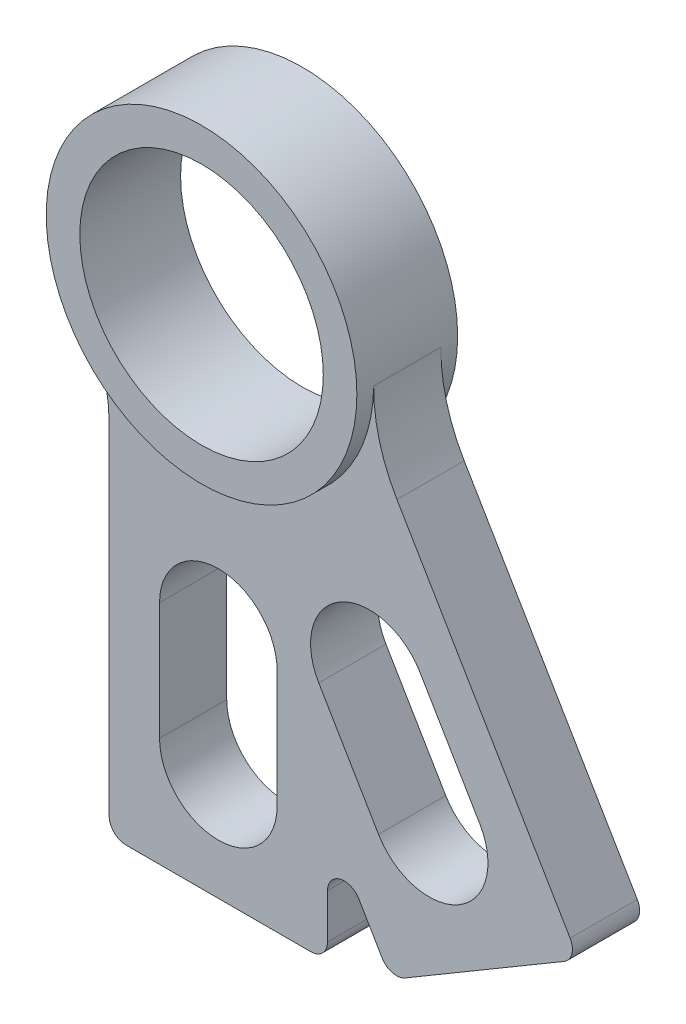
ISO-10303-21;
HEADER;
FILE_DESCRIPTION(('STEP AP214'),'2;1');
FILE_NAME('part.step','',(''),(''),'','','');
FILE_SCHEMA(('AUTOMOTIVE_DESIGN { 1 0 10303 214 1 1 1 1 }'));
ENDSEC;
DATA;
#1=APPLICATION_CONTEXT('core data for automotive mechanical design processes');
#2=APPLICATION_PROTOCOL_DEFINITION('international standard','automotive_design',2000,#1);
#3=PRODUCT_CONTEXT('',#1,'mechanical');
#4=PRODUCT('Part','Part','',(#3));
#5=PRODUCT_RELATED_PRODUCT_CATEGORY('part','',(#4));
#6=PRODUCT_DEFINITION_FORMATION('','',#4);
#7=PRODUCT_DEFINITION_CONTEXT('part definition',#1,'design');
#8=PRODUCT_DEFINITION('design','',#6,#7);
#9=PRODUCT_DEFINITION_SHAPE('','',#8);
#10=(LENGTH_UNIT() NAMED_UNIT(*) SI_UNIT(.MILLI.,.METRE.));
#11=(NAMED_UNIT(*) PLANE_ANGLE_UNIT() SI_UNIT($,.RADIAN.));
#12=(NAMED_UNIT(*) SI_UNIT($,.STERADIAN.) SOLID_ANGLE_UNIT());
#13=UNCERTAINTY_MEASURE_WITH_UNIT(LENGTH_MEASURE(1.E-05),#10,'distance_accuracy_value','');
#14=(GEOMETRIC_REPRESENTATION_CONTEXT(3) GLOBAL_UNCERTAINTY_ASSIGNED_CONTEXT((#13)) GLOBAL_UNIT_ASSIGNED_CONTEXT((#10,
#11,#12)) REPRESENTATION_CONTEXT('',''));
#15=CARTESIAN_POINT('',(0.,0.,0.));
#16=DIRECTION('',(0.,0.,1.));
#17=DIRECTION('',(1.,0.,0.));
#18=AXIS2_PLACEMENT_3D('',#15,#16,#17);
#19=CARTESIAN_POINT('',(0.,-27.9580697939255,4.7625));
#20=DIRECTION('',(0.,0.,-1.));
#21=DIRECTION('',(-1.,0.,0.));
#22=AXIS2_PLACEMENT_3D('',#19,#20,#21);
#23=CYLINDRICAL_SURFACE('',#22,5.55624999999843);
#24=CARTESIAN_POINT('',(0.,-27.9580697939255,-3.175));
#25=DIRECTION('',(0.,0.,1.));
#26=DIRECTION('',(1.,0.,0.));
#27=AXIS2_PLACEMENT_3D('',#24,#25,#26);
#28=CIRCLE('',#27,5.55624999999843);
#29=CARTESIAN_POINT('',(5.55624999999841,-27.9580697939255,-3.175));
#30=VERTEX_POINT('',#29);
#31=CARTESIAN_POINT('',(-5.55624999999843,-27.9580697939256,-3.175));
#32=VERTEX_POINT('',#31);
#33=EDGE_CURVE('E545',#30,#32,#28,.T.);
#34=ORIENTED_EDGE('',*,*,#33,.F.);
#35=DIRECTION('',(0.,0.,-1.));
#36=VECTOR('',#35,1.);
#37=CARTESIAN_POINT('',(5.55624999999843,-27.9580697939256,4.7625));
#38=LINE('',#37,#36);
#39=CARTESIAN_POINT('',(5.55624999999843,-27.9580697939256,3.175));
#40=VERTEX_POINT('',#39);
#41=EDGE_CURVE('E395',#40,#30,#38,.T.);
#42=ORIENTED_EDGE('',*,*,#41,.F.);
#43=CARTESIAN_POINT('',(0.,-27.9580697939255,3.175));
#44=DIRECTION('',(0.,0.,1.));
#45=DIRECTION('',(1.,0.,0.));
#46=AXIS2_PLACEMENT_3D('',#43,#44,#45);
#47=CIRCLE('',#46,5.55624999999843);
#48=CARTESIAN_POINT('',(-5.55624999999843,-27.9580697939256,3.175));
#49=VERTEX_POINT('',#48);
#50=EDGE_CURVE('E503',#40,#49,#47,.T.);
#51=ORIENTED_EDGE('',*,*,#50,.T.);
#52=DIRECTION('',(0.,0.,-1.));
#53=VECTOR('',#52,1.);
#54=CARTESIAN_POINT('',(-5.55624999999843,-27.9580697939256,4.7625));
#55=LINE('',#54,#53);
#56=EDGE_CURVE('E372',#49,#32,#55,.T.);
#57=ORIENTED_EDGE('',*,*,#56,.T.);
#58=EDGE_LOOP('',(#34,#42,#51,#57));
#59=FACE_BOUND('',#58,.T.);
#60=ADVANCED_FACE('F195',(#59),#23,.F.);
#61=CARTESIAN_POINT('',(5.55624999999831,0.,4.7625));
#62=DIRECTION('',(-1.,0.,0.));
#63=DIRECTION('',(0.,-1.,0.));
#64=AXIS2_PLACEMENT_3D('',#61,#62,#63);
#65=PLANE('',#64);
#66=DIRECTION('',(0.,1.,0.));
#67=VECTOR('',#66,1.);
#68=CARTESIAN_POINT('',(5.55624999999831,0.,-3.175));
#69=LINE('',#68,#67);
#70=CARTESIAN_POINT('',(5.55624999999842,-39.0705697939288,-3.175));
#71=VERTEX_POINT('',#70);
#72=EDGE_CURVE('E562',#71,#30,#69,.T.);
#73=ORIENTED_EDGE('',*,*,#72,.F.);
#74=DIRECTION('',(0.,0.,-1.));
#75=VECTOR('',#74,1.);
#76=CARTESIAN_POINT('',(5.55624999999848,-39.0705697939288,4.7625));
#77=LINE('',#76,#75);
#78=CARTESIAN_POINT('',(5.55624999999848,-39.0705697939288,3.175));
#79=VERTEX_POINT('',#78);
#80=EDGE_CURVE('E540',#79,#71,#77,.T.);
#81=ORIENTED_EDGE('',*,*,#80,.F.);
#82=DIRECTION('',(0.,-1.,0.));
#83=VECTOR('',#82,1.);
#84=CARTESIAN_POINT('',(5.55624999999831,0.,3.175));
#85=LINE('',#84,#83);
#86=EDGE_CURVE('E509',#40,#79,#85,.T.);
#87=ORIENTED_EDGE('',*,*,#86,.F.);
#88=ORIENTED_EDGE('',*,*,#41,.T.);
#89=EDGE_LOOP('',(#73,#81,#87,#88));
#90=FACE_BOUND('',#89,.T.);
#91=ADVANCED_FACE('F539',(#90),#65,.T.);
#92=CARTESIAN_POINT('',(0.,-39.0705697939288,4.7625));
#93=DIRECTION('',(0.,0.,-1.));
#94=DIRECTION('',(-1.,0.,0.));
#95=AXIS2_PLACEMENT_3D('',#92,#93,#94);
#96=CYLINDRICAL_SURFACE('',#95,5.55624999999845);
#97=CARTESIAN_POINT('',(0.,-39.0705697939288,-3.175));
#98=DIRECTION('',(0.,0.,1.));
#99=DIRECTION('',(1.,0.,0.));
#100=AXIS2_PLACEMENT_3D('',#97,#98,#99);
#101=CIRCLE('',#100,5.55624999999845);
#102=CARTESIAN_POINT('',(-5.55624999999848,-39.0705697939288,-3.175));
#103=VERTEX_POINT('',#102);
#104=EDGE_CURVE('E564',#103,#71,#101,.T.);
#105=ORIENTED_EDGE('',*,*,#104,.F.);
#106=DIRECTION('',(0.,0.,-1.));
#107=VECTOR('',#106,1.);
#108=CARTESIAN_POINT('',(-5.55624999999842,-39.0705697939288,4.7625));
#109=LINE('',#108,#107);
#110=CARTESIAN_POINT('',(-5.55624999999842,-39.0705697939288,3.175));
#111=VERTEX_POINT('',#110);
#112=EDGE_CURVE('E547',#111,#103,#109,.T.);
#113=ORIENTED_EDGE('',*,*,#112,.F.);
#114=CARTESIAN_POINT('',(0.,-39.0705697939288,3.175));
#115=DIRECTION('',(0.,0.,1.));
#116=DIRECTION('',(1.,0.,0.));
#117=AXIS2_PLACEMENT_3D('',#114,#115,#116);
#118=CIRCLE('',#117,5.55624999999845);
#119=EDGE_CURVE('E525',#111,#79,#118,.T.);
#120=ORIENTED_EDGE('',*,*,#119,.T.);
#121=ORIENTED_EDGE('',*,*,#80,.T.);
#122=EDGE_LOOP('',(#105,#113,#120,#121));
#123=FACE_BOUND('',#122,.T.);
#124=ADVANCED_FACE('F603',(#123),#96,.F.);
#125=CARTESIAN_POINT('',(14.2753624537517,-24.1864667147498,4.7625));
#126=DIRECTION('',(0.,0.,-1.));
#127=DIRECTION('',(-1.,0.,0.));
#128=AXIS2_PLACEMENT_3D('',#125,#126,#127);
#129=CYLINDRICAL_SURFACE('',#128,5.55624999999839);
#130=CARTESIAN_POINT('',(14.2753624537518,-24.1864667147499,-3.175));
#131=DIRECTION('',(0.,0.,1.));
#132=DIRECTION('',(1.,0.,0.));
#133=AXIS2_PLACEMENT_3D('',#130,#131,#132);
#134=CIRCLE('',#133,5.55624999999841);
#135=CARTESIAN_POINT('',(19.0603267308516,-21.3622799416485,-3.175));
#136=VERTEX_POINT('',#135);
#137=CARTESIAN_POINT('',(9.49039817665191,-27.0106534878512,-3.175));
#138=VERTEX_POINT('',#137);
#139=EDGE_CURVE('E365',#136,#138,#134,.T.);
#140=ORIENTED_EDGE('',*,*,#139,.F.);
#141=DIRECTION('',(0.,0.,-1.));
#142=VECTOR('',#141,1.);
#143=CARTESIAN_POINT('',(19.0603267308515,-21.3622799416484,4.7625));
#144=LINE('',#143,#142);
#145=CARTESIAN_POINT('',(19.0603267308516,-21.3622799416485,3.175));
#146=VERTEX_POINT('',#145);
#147=EDGE_CURVE('E364',#146,#136,#144,.T.);
#148=ORIENTED_EDGE('',*,*,#147,.F.);
#149=CARTESIAN_POINT('',(14.2753624537518,-24.1864667147499,3.175));
#150=DIRECTION('',(0.,0.,1.));
#151=DIRECTION('',(1.,0.,0.));
#152=AXIS2_PLACEMENT_3D('',#149,#150,#151);
#153=CIRCLE('',#152,5.55624999999841);
#154=CARTESIAN_POINT('',(9.49039817665196,-27.0106534878513,3.175));
#155=VERTEX_POINT('',#154);
#156=EDGE_CURVE('E514',#146,#155,#153,.T.);
#157=ORIENTED_EDGE('',*,*,#156,.T.);
#158=DIRECTION('',(0.,0.,-1.));
#159=VECTOR('',#158,1.);
#160=CARTESIAN_POINT('',(9.49039817665191,-27.0106534878512,4.7625));
#161=LINE('',#160,#159);
#162=EDGE_CURVE('E374',#155,#138,#161,.T.);
#163=ORIENTED_EDGE('',*,*,#162,.T.);
#164=EDGE_LOOP('',(#140,#148,#157,#163));
#165=FACE_BOUND('',#164,.T.);
#166=ADVANCED_FACE('F552',(#165),#129,.F.);
#167=CARTESIAN_POINT('',(4.78496427709968,2.82418677310135,4.7625));
#168=DIRECTION('',(-0.861185921638007,-0.508290082898041,0.));
#169=DIRECTION('',(0.508290082898041,-0.861185921638007,0.));
#170=AXIS2_PLACEMENT_3D('',#167,#168,#169);
#171=PLANE('',#170);
#172=DIRECTION('',(-0.508290082898038,0.861185921638008,0.));
#173=VECTOR('',#172,1.);
#174=CARTESIAN_POINT('',(4.78496427709981,2.82418677310141,-3.175));
#175=LINE('',#174,#173);
#176=CARTESIAN_POINT('',(24.7087002770577,-30.9322084958536,-3.175));
#177=VERTEX_POINT('',#176);
#178=EDGE_CURVE('E347',#177,#136,#175,.T.);
#179=ORIENTED_EDGE('',*,*,#178,.F.);
#180=DIRECTION('',(0.,0.,-1.));
#181=VECTOR('',#180,1.);
#182=CARTESIAN_POINT('',(24.7087002770581,-30.9322084958544,4.7625));
#183=LINE('',#182,#181);
#184=CARTESIAN_POINT('',(24.7087002770577,-30.9322084958536,3.175));
#185=VERTEX_POINT('',#184);
#186=EDGE_CURVE('E362',#185,#177,#183,.T.);
#187=ORIENTED_EDGE('',*,*,#186,.F.);
#188=DIRECTION('',(0.508290082898038,-0.861185921638008,0.));
#189=VECTOR('',#188,1.);
#190=CARTESIAN_POINT('',(4.78496427709981,2.82418677310141,3.175));
#191=LINE('',#190,#189);
#192=EDGE_CURVE('E520',#146,#185,#191,.T.);
#193=ORIENTED_EDGE('',*,*,#192,.F.);
#194=ORIENTED_EDGE('',*,*,#147,.T.);
#195=EDGE_LOOP('',(#179,#187,#193,#194));
#196=FACE_BOUND('',#195,.T.);
#197=ADVANCED_FACE('F360',(#196),#171,.T.);
#198=CARTESIAN_POINT('',(19.9237359999578,-33.7563952689549,4.7625));
#199=DIRECTION('',(0.,0.,-1.));
#200=DIRECTION('',(-1.,0.,0.));
#201=AXIS2_PLACEMENT_3D('',#198,#199,#200);
#202=CYLINDRICAL_SURFACE('',#201,5.55624999999839);
#203=CARTESIAN_POINT('',(19.9237359999578,-33.756395268955,-3.175));
#204=DIRECTION('',(0.,0.,1.));
#205=DIRECTION('',(1.,0.,0.));
#206=AXIS2_PLACEMENT_3D('',#203,#204,#205);
#207=CIRCLE('',#206,5.55624999999841);
#208=CARTESIAN_POINT('',(15.138771722858,-36.5805820420564,-3.175));
#209=VERTEX_POINT('',#208);
#210=EDGE_CURVE('E343',#209,#177,#207,.T.);
#211=ORIENTED_EDGE('',*,*,#210,.F.);
#212=DIRECTION('',(0.,0.,-1.));
#213=VECTOR('',#212,1.);
#214=CARTESIAN_POINT('',(15.1387717228585,-36.5805820420572,4.7625));
#215=LINE('',#214,#213);
#216=CARTESIAN_POINT('',(15.1387717228585,-36.5805820420572,3.175));
#217=VERTEX_POINT('',#216);
#218=EDGE_CURVE('E370',#217,#209,#215,.T.);
#219=ORIENTED_EDGE('',*,*,#218,.F.);
#220=CARTESIAN_POINT('',(19.9237359999578,-33.756395268955,3.175));
#221=DIRECTION('',(0.,0.,1.));
#222=DIRECTION('',(1.,0.,0.));
#223=AXIS2_PLACEMENT_3D('',#220,#221,#222);
#224=CIRCLE('',#223,5.55624999999841);
#225=EDGE_CURVE('E369',#217,#185,#224,.T.);
#226=ORIENTED_EDGE('',*,*,#225,.T.);
#227=ORIENTED_EDGE('',*,*,#186,.T.);
#228=EDGE_LOOP('',(#211,#219,#226,#227));
#229=FACE_BOUND('',#228,.T.);
#230=ADVANCED_FACE('F368',(#229),#202,.F.);
#231=CARTESIAN_POINT('',(30.5552874473023,-0.236151334171532,4.7625));
#232=DIRECTION('',(0.,0.,-1.));
#233=DIRECTION('',(-1.,0.,0.));
#234=AXIS2_PLACEMENT_3D('',#231,#232,#233);
#235=CYLINDRICAL_SURFACE('',#234,15.8749999999985);
#236=DIRECTION('',(0.,0.,-1.));
#237=VECTOR('',#236,1.);
#238=CARTESIAN_POINT('',(16.8839609413002,-8.30525640017702,4.7625));
#239=LINE('',#238,#237);
#240=CARTESIAN_POINT('',(16.8839609413003,-8.30525640017706,3.175));
#241=VERTEX_POINT('',#240);
#242=CARTESIAN_POINT('',(16.8839609413003,-8.30525640017706,-3.175));
#243=VERTEX_POINT('',#242);
#244=EDGE_CURVE('E378',#241,#243,#239,.T.);
#245=ORIENTED_EDGE('',*,*,#244,.T.);
#246=CARTESIAN_POINT('',(30.5552874473023,-0.236151334171521,-3.175));
#247=DIRECTION('',(0.,0.,1.));
#248=DIRECTION('',(1.,0.,0.));
#249=AXIS2_PLACEMENT_3D('',#246,#247,#248);
#250=CIRCLE('',#249,15.8749999999984);
#251=CARTESIAN_POINT('',(14.68076154991,-0.113462569535451,-3.175));
#252=VERTEX_POINT('',#251);
#253=EDGE_CURVE('E568',#252,#243,#250,.T.);
#254=ORIENTED_EDGE('',*,*,#253,.F.);
#255=DIRECTION('',(0.,0.,-1.));
#256=VECTOR('',#255,1.);
#257=CARTESIAN_POINT('',(14.68076154991,-0.113462569535464,4.7625));
#258=LINE('',#257,#256);
#259=CARTESIAN_POINT('',(14.68076154991,-0.113462569535451,3.175));
#260=VERTEX_POINT('',#259);
#261=EDGE_CURVE('E388',#260,#252,#258,.T.);
#262=ORIENTED_EDGE('',*,*,#261,.F.);
#263=CARTESIAN_POINT('',(30.5552874473023,-0.236151334171521,3.175));
#264=DIRECTION('',(0.,0.,1.));
#265=DIRECTION('',(1.,0.,0.));
#266=AXIS2_PLACEMENT_3D('',#263,#264,#265);
#267=CIRCLE('',#266,15.8749999999984);
#268=EDGE_CURVE('E471',#260,#241,#267,.T.);
#269=ORIENTED_EDGE('',*,*,#268,.T.);
#270=EDGE_LOOP('',(#245,#254,#262,#269));
#271=FACE_BOUND('',#270,.T.);
#272=ADVANCED_FACE('F613',(#271),#235,.F.);
#273=CARTESIAN_POINT('',(-26.1937499999968,-15.7343197939272,4.7625));
#274=DIRECTION('',(0.,0.,-1.));
#275=DIRECTION('',(-1.,0.,0.));
#276=AXIS2_PLACEMENT_3D('',#273,#274,#275);
#277=CYLINDRICAL_SURFACE('',#276,15.8749999999984);
#278=CARTESIAN_POINT('',(-26.1937499999968,-15.7343197939272,-3.175));
#279=DIRECTION('',(0.,0.,1.));
#280=DIRECTION('',(1.,0.,0.));
#281=AXIS2_PLACEMENT_3D('',#278,#279,#280);
#282=CIRCLE('',#281,15.8749999999984);
#283=CARTESIAN_POINT('',(-10.3187499999984,-15.7343197939272,-3.175));
#284=VERTEX_POINT('',#283);
#285=CARTESIAN_POINT('',(-12.5851932668321,-7.55979787272683,-3.175));
#286=VERTEX_POINT('',#285);
#287=EDGE_CURVE('E573',#284,#286,#282,.T.);
#288=ORIENTED_EDGE('',*,*,#287,.F.);
#289=DIRECTION('',(0.,0.,-1.));
#290=VECTOR('',#289,1.);
#291=CARTESIAN_POINT('',(-10.3187499999984,-15.7343197939272,4.7625));
#292=LINE('',#291,#290);
#293=CARTESIAN_POINT('',(-10.3187499999984,-15.7343197939272,3.175));
#294=VERTEX_POINT('',#293);
#295=EDGE_CURVE('E381',#294,#284,#292,.T.);
#296=ORIENTED_EDGE('',*,*,#295,.F.);
#297=CARTESIAN_POINT('',(-26.1937499999968,-15.7343197939272,3.175));
#298=DIRECTION('',(0.,0.,1.));
#299=DIRECTION('',(1.,0.,0.));
#300=AXIS2_PLACEMENT_3D('',#297,#298,#299);
#301=CIRCLE('',#300,15.8749999999984);
#302=CARTESIAN_POINT('',(-12.5851932668321,-7.55979787272683,3.175));
#303=VERTEX_POINT('',#302);
#304=EDGE_CURVE('E465',#294,#303,#301,.T.);
#305=ORIENTED_EDGE('',*,*,#304,.T.);
#306=DIRECTION('',(0.,0.,-1.));
#307=VECTOR('',#306,1.);
#308=CARTESIAN_POINT('',(-12.5851932668321,-7.55979787272684,4.7625));
#309=LINE('',#308,#307);
#310=EDGE_CURVE('E385',#303,#286,#309,.T.);
#311=ORIENTED_EDGE('',*,*,#310,.T.);
#312=EDGE_LOOP('',(#288,#296,#305,#311));
#313=FACE_BOUND('',#312,.T.);
#314=ADVANCED_FACE('F637',(#313),#277,.F.);
#315=CARTESIAN_POINT('',(-10.3187499999984,0.,4.7625));
#316=DIRECTION('',(1.,0.,0.));
#317=DIRECTION('',(0.,1.,0.));
#318=AXIS2_PLACEMENT_3D('',#315,#316,#317);
#319=PLANE('',#318);
#320=DIRECTION('',(0.,-1.,0.));
#321=VECTOR('',#320,1.);
#322=CARTESIAN_POINT('',(-10.3187499999984,0.,-3.175));
#323=LINE('',#322,#321);
#324=CARTESIAN_POINT('',(-10.3187499999984,-47.8018197939272,-3.175));
#325=VERTEX_POINT('',#324);
#326=EDGE_CURVE('E576',#284,#325,#323,.T.);
#327=ORIENTED_EDGE('',*,*,#326,.T.);
#328=DIRECTION('',(0.,0.,-1.));
#329=VECTOR('',#328,1.);
#330=CARTESIAN_POINT('',(-10.3187499999984,-47.8018197939272,4.7625));
#331=LINE('',#330,#329);
#332=CARTESIAN_POINT('',(-10.3187499999984,-47.8018197939272,3.175));
#333=VERTEX_POINT('',#332);
#334=EDGE_CURVE('E430',#325,#333,#331,.F.);
#335=ORIENTED_EDGE('',*,*,#334,.T.);
#336=DIRECTION('',(0.,1.,0.));
#337=VECTOR('',#336,1.);
#338=CARTESIAN_POINT('',(-10.3187499999984,0.,3.175));
#339=LINE('',#338,#337);
#340=EDGE_CURVE('E463',#333,#294,#339,.T.);
#341=ORIENTED_EDGE('',*,*,#340,.T.);
#342=ORIENTED_EDGE('',*,*,#295,.T.);
#343=EDGE_LOOP('',(#327,#335,#341,#342));
#344=FACE_BOUND('',#343,.T.);
#345=ADVANCED_FACE('F633',(#344),#319,.F.);
#346=CARTESIAN_POINT('',(0.,-49.3893197939272,4.7625));
#347=DIRECTION('',(0.,1.,0.));
#348=DIRECTION('',(-1.,0.,0.));
#349=AXIS2_PLACEMENT_3D('',#346,#347,#348);
#350=PLANE('',#349);
#351=DIRECTION('',(1.,0.,0.));
#352=VECTOR('',#351,1.);
#353=CARTESIAN_POINT('',(0.,-49.3893197939272,-3.175));
#354=LINE('',#353,#352);
#355=CARTESIAN_POINT('',(-8.73124999999842,-49.3893197939272,-3.175));
#356=VERTEX_POINT('',#355);
#357=CARTESIAN_POINT('',(8.73124999999837,-49.3893197939272,-3.175));
#358=VERTEX_POINT('',#357);
#359=EDGE_CURVE('E445',#356,#358,#354,.T.);
#360=ORIENTED_EDGE('',*,*,#359,.T.);
#361=DIRECTION('',(0.,0.,-1.));
#362=VECTOR('',#361,1.);
#363=CARTESIAN_POINT('',(8.73124999999837,-49.3893197939272,3.175));
#364=LINE('',#363,#362);
#365=CARTESIAN_POINT('',(8.73124999999837,-49.3893197939272,3.175));
#366=VERTEX_POINT('',#365);
#367=EDGE_CURVE('E428',#358,#366,#364,.F.);
#368=ORIENTED_EDGE('',*,*,#367,.T.);
#369=DIRECTION('',(-1.,0.,0.));
#370=VECTOR('',#369,1.);
#371=CARTESIAN_POINT('',(0.,-49.3893197939272,3.175));
#372=LINE('',#371,#370);
#373=CARTESIAN_POINT('',(-8.73124999999842,-49.3893197939272,3.175));
#374=VERTEX_POINT('',#373);
#375=EDGE_CURVE('E454',#366,#374,#372,.T.);
#376=ORIENTED_EDGE('',*,*,#375,.T.);
#377=DIRECTION('',(0.,0.,-1.));
#378=VECTOR('',#377,1.);
#379=CARTESIAN_POINT('',(-8.73124999999842,-49.3893197939272,4.7625));
#380=LINE('',#379,#378);
#381=EDGE_CURVE('E425',#374,#356,#380,.T.);
#382=ORIENTED_EDGE('',*,*,#381,.T.);
#383=EDGE_LOOP('',(#360,#368,#376,#382));
#384=FACE_BOUND('',#383,.T.);
#385=ADVANCED_FACE('F630',(#384),#350,.F.);
#386=CARTESIAN_POINT('',(10.3187499999986,0.,4.7625));
#387=DIRECTION('',(1.,0.,0.));
#388=DIRECTION('',(0.,1.,0.));
#389=AXIS2_PLACEMENT_3D('',#386,#387,#388);
#390=PLANE('',#389);
#391=DIRECTION('',(0.,-1.,0.));
#392=VECTOR('',#391,1.);
#393=CARTESIAN_POINT('',(10.3187499999986,0.,-3.175));
#394=LINE('',#393,#392);
#395=CARTESIAN_POINT('',(10.3187499999984,-43.5966500726412,-3.175));
#396=VERTEX_POINT('',#395);
#397=CARTESIAN_POINT('',(10.3187499999984,-47.8018197939272,-3.175));
#398=VERTEX_POINT('',#397);
#399=EDGE_CURVE('E436',#396,#398,#394,.T.);
#400=ORIENTED_EDGE('',*,*,#399,.F.);
#401=DIRECTION('',(0.,0.,-1.));
#402=VECTOR('',#401,1.);
#403=CARTESIAN_POINT('',(10.3187499999984,-43.5966500726412,3.175));
#404=LINE('',#403,#402);
#405=CARTESIAN_POINT('',(10.3187499999984,-43.5966500726412,3.175));
#406=VERTEX_POINT('',#405);
#407=EDGE_CURVE('E423',#396,#406,#404,.F.);
#408=ORIENTED_EDGE('',*,*,#407,.T.);
#409=DIRECTION('',(0.,1.,0.));
#410=VECTOR('',#409,1.);
#411=CARTESIAN_POINT('',(10.3187499999986,0.,3.175));
#412=LINE('',#411,#410);
#413=CARTESIAN_POINT('',(10.3187499999984,-47.8018197939272,3.175));
#414=VERTEX_POINT('',#413);
#415=EDGE_CURVE('E451',#414,#406,#412,.T.);
#416=ORIENTED_EDGE('',*,*,#415,.F.);
#417=DIRECTION('',(0.,0.,-1.));
#418=VECTOR('',#417,1.);
#419=CARTESIAN_POINT('',(10.3187499999984,-47.8018197939272,-3.175));
#420=LINE('',#419,#418);
#421=EDGE_CURVE('E420',#414,#398,#420,.T.);
#422=ORIENTED_EDGE('',*,*,#421,.T.);
#423=EDGE_LOOP('',(#400,#408,#416,#422));
#424=FACE_BOUND('',#423,.T.);
#425=ADVANCED_FACE('F442',(#424),#390,.T.);
#426=CARTESIAN_POINT('',(-8.88636222890087,-5.24491829290337,4.7625));
#427=DIRECTION('',(-0.861185921638007,-0.508290082898039,0.));
#428=DIRECTION('',(0.508290082898039,-0.861185921638007,0.));
#429=AXIS2_PLACEMENT_3D('',#426,#427,#428);
#430=PLANE('',#429);
#431=DIRECTION('',(-0.508290082898037,0.861185921638009,0.));
#432=VECTOR('',#431,1.);
#433=CARTESIAN_POINT('',(-8.88636222890078,-5.24491829290328,-3.175));
#434=LINE('',#433,#432);
#435=CARTESIAN_POINT('',(15.4753815573597,-46.5205431401588,-3.175));
#436=VERTEX_POINT('',#435);
#437=CARTESIAN_POINT('',(13.2733826505987,-42.7897395660406,-3.175));
#438=VERTEX_POINT('',#437);
#439=EDGE_CURVE('E437',#436,#438,#434,.T.);
#440=ORIENTED_EDGE('',*,*,#439,.F.);
#441=DIRECTION('',(0.,0.,-1.));
#442=VECTOR('',#441,1.);
#443=CARTESIAN_POINT('',(15.4753815573597,-46.5205431401588,3.175));
#444=LINE('',#443,#442);
#445=CARTESIAN_POINT('',(15.4753815573597,-46.5205431401588,3.175));
#446=VERTEX_POINT('',#445);
#447=EDGE_CURVE('E210',#436,#446,#444,.F.);
#448=ORIENTED_EDGE('',*,*,#447,.T.);
#449=DIRECTION('',(0.508290082898037,-0.861185921638009,0.));
#450=VECTOR('',#449,1.);
#451=CARTESIAN_POINT('',(-8.88636222890078,-5.24491829290328,3.175));
#452=LINE('',#451,#450);
#453=CARTESIAN_POINT('',(13.2733826505987,-42.7897395660406,3.175));
#454=VERTEX_POINT('',#453);
#455=EDGE_CURVE('E449',#454,#446,#452,.T.);
#456=ORIENTED_EDGE('',*,*,#455,.F.);
#457=DIRECTION('',(0.,0.,-1.));
#458=VECTOR('',#457,1.);
#459=CARTESIAN_POINT('',(13.2733826505987,-42.7897395660406,-3.175));
#460=LINE('',#459,#458);
#461=EDGE_CURVE('E416',#454,#438,#460,.T.);
#462=ORIENTED_EDGE('',*,*,#461,.T.);
#463=EDGE_LOOP('',(#440,#448,#456,#462));
#464=FACE_BOUND('',#463,.T.);
#465=ADVANCED_FACE('F448',(#464),#430,.T.);
#466=CARTESIAN_POINT('',(25.1686542928595,-42.6427574978573,4.7625));
#467=DIRECTION('',(-0.508290082898,0.861185921638031,0.));
#468=DIRECTION('',(-0.861185921638031,-0.508290082898,0.));
#469=AXIS2_PLACEMENT_3D('',#466,#467,#468);
#470=PLANE('',#469);
#471=DIRECTION('',(0.861185921638008,0.508290082898038,0.));
#472=VECTOR('',#471,1.);
#473=CARTESIAN_POINT('',(25.1686542928612,-42.6427574978558,-3.175));
#474=LINE('',#473,#472);
#475=CARTESIAN_POINT('',(17.6494247145606,-47.0807652841585,-3.175));
#476=VERTEX_POINT('',#475);
#477=CARTESIAN_POINT('',(32.6878838711616,-38.2047497115532,-3.175));
#478=VERTEX_POINT('',#477);
#479=EDGE_CURVE('E582',#476,#478,#474,.T.);
#480=ORIENTED_EDGE('',*,*,#479,.T.);
#481=DIRECTION('',(0.,0.,-1.));
#482=VECTOR('',#481,1.);
#483=CARTESIAN_POINT('',(32.687883871162,-38.2047497115539,4.7625));
#484=LINE('',#483,#482);
#485=CARTESIAN_POINT('',(32.6878838711616,-38.2047497115532,3.175));
#486=VERTEX_POINT('',#485);
#487=EDGE_CURVE('E406',#478,#486,#484,.F.);
#488=ORIENTED_EDGE('',*,*,#487,.T.);
#489=DIRECTION('',(-0.861185921638008,-0.508290082898038,0.));
#490=VECTOR('',#489,1.);
#491=CARTESIAN_POINT('',(25.1686542928612,-42.6427574978558,3.175));
#492=LINE('',#491,#490);
#493=CARTESIAN_POINT('',(17.6494247145606,-47.0807652841585,3.175));
#494=VERTEX_POINT('',#493);
#495=EDGE_CURVE('E452',#486,#494,#492,.T.);
#496=ORIENTED_EDGE('',*,*,#495,.T.);
#497=DIRECTION('',(0.,0.,-1.));
#498=VECTOR('',#497,1.);
#499=CARTESIAN_POINT('',(17.6494247145607,-47.0807652841585,-3.175));
#500=LINE('',#499,#498);
#501=EDGE_CURVE('E403',#494,#476,#500,.T.);
#502=ORIENTED_EDGE('',*,*,#501,.T.);
#503=EDGE_LOOP('',(#480,#488,#496,#502));
#504=FACE_BOUND('',#503,.T.);
#505=ADVANCED_FACE('F622',(#504),#470,.F.);
#506=CARTESIAN_POINT('',(-5.55624999999844,0.,4.7625));
#507=DIRECTION('',(-1.,0.,0.));
#508=DIRECTION('',(0.,-1.,0.));
#509=AXIS2_PLACEMENT_3D('',#506,#507,#508);
#510=PLANE('',#509);
#511=ORIENTED_EDGE('',*,*,#112,.T.);
#512=DIRECTION('',(0.,1.,0.));
#513=VECTOR('',#512,1.);
#514=CARTESIAN_POINT('',(-5.55624999999844,0.,-3.175));
#515=LINE('',#514,#513);
#516=EDGE_CURVE('E355',#103,#32,#515,.T.);
#517=ORIENTED_EDGE('',*,*,#516,.T.);
#518=ORIENTED_EDGE('',*,*,#56,.F.);
#519=DIRECTION('',(0.,-1.,0.));
#520=VECTOR('',#519,1.);
#521=CARTESIAN_POINT('',(-5.55624999999844,0.,3.175));
#522=LINE('',#521,#520);
#523=EDGE_CURVE('E508',#49,#111,#522,.T.);
#524=ORIENTED_EDGE('',*,*,#523,.T.);
#525=EDGE_LOOP('',(#511,#517,#518,#524));
#526=FACE_BOUND('',#525,.T.);
#527=ADVANCED_FACE('F610',(#526),#510,.F.);
#528=CARTESIAN_POINT('',(-4.78496427709989,-2.82418677310147,4.7625));
#529=DIRECTION('',(-0.861185921638007,-0.50829008289804,0.));
#530=DIRECTION('',(0.50829008289804,-0.861185921638007,0.));
#531=AXIS2_PLACEMENT_3D('',#528,#529,#530);
#532=PLANE('',#531);
#533=ORIENTED_EDGE('',*,*,#218,.T.);
#534=DIRECTION('',(-0.508290082898038,0.861185921638008,0.));
#535=VECTOR('',#534,1.);
#536=CARTESIAN_POINT('',(-4.78496427709981,-2.82418677310141,-3.175));
#537=LINE('',#536,#535);
#538=EDGE_CURVE('E350',#209,#138,#537,.T.);
#539=ORIENTED_EDGE('',*,*,#538,.T.);
#540=ORIENTED_EDGE('',*,*,#162,.F.);
#541=DIRECTION('',(0.508290082898038,-0.861185921638008,0.));
#542=VECTOR('',#541,1.);
#543=CARTESIAN_POINT('',(-4.78496427709981,-2.82418677310141,3.175));
#544=LINE('',#543,#542);
#545=EDGE_CURVE('E519',#155,#217,#544,.T.);
#546=ORIENTED_EDGE('',*,*,#545,.T.);
#547=EDGE_LOOP('',(#533,#539,#540,#546));
#548=FACE_BOUND('',#547,.T.);
#549=ADVANCED_FACE('F554',(#548),#532,.F.);
#550=CARTESIAN_POINT('',(8.88636222890067,5.24491829290326,4.7625));
#551=DIRECTION('',(-0.861185921638007,-0.50829008289804,0.));
#552=DIRECTION('',(0.50829008289804,-0.861185921638007,0.));
#553=AXIS2_PLACEMENT_3D('',#550,#551,#552);
#554=PLANE('',#553);
#555=DIRECTION('',(0.508290082898037,-0.861185921638009,0.));
#556=VECTOR('',#555,1.);
#557=CARTESIAN_POINT('',(8.88636222890083,5.24491829290331,3.175));
#558=LINE('',#557,#556);
#559=CARTESIAN_POINT('',(33.2481060151617,-36.0307065543529,3.175));
#560=VERTEX_POINT('',#559);
#561=EDGE_CURVE('E457',#241,#560,#558,.T.);
#562=ORIENTED_EDGE('',*,*,#561,.T.);
#563=DIRECTION('',(0.,0.,-1.));
#564=VECTOR('',#563,1.);
#565=CARTESIAN_POINT('',(33.2481060151617,-36.0307065543528,4.7625));
#566=LINE('',#565,#564);
#567=CARTESIAN_POINT('',(33.2481060151617,-36.0307065543529,-3.175));
#568=VERTEX_POINT('',#567);
#569=EDGE_CURVE('E391',#560,#568,#566,.T.);
#570=ORIENTED_EDGE('',*,*,#569,.T.);
#571=DIRECTION('',(-0.508290082898037,0.861185921638009,0.));
#572=VECTOR('',#571,1.);
#573=CARTESIAN_POINT('',(8.88636222890083,5.24491829290331,-3.175));
#574=LINE('',#573,#572);
#575=EDGE_CURVE('E566',#568,#243,#574,.T.);
#576=ORIENTED_EDGE('',*,*,#575,.T.);
#577=ORIENTED_EDGE('',*,*,#244,.F.);
#578=EDGE_LOOP('',(#562,#570,#576,#577));
#579=FACE_BOUND('',#578,.T.);
#580=ADVANCED_FACE('F609',(#579),#554,.F.);
#581=CARTESIAN_POINT('',(0.,0.,4.7625));
#582=DIRECTION('',(0.,0.,1.));
#583=DIRECTION('',(1.,0.,0.));
#584=AXIS2_PLACEMENT_3D('',#581,#582,#583);
#585=PLANE('',#584);
#586=CARTESIAN_POINT('',(0.,0.,4.7625));
#587=DIRECTION('',(0.,0.,1.));
#588=DIRECTION('',(1.,0.,0.));
#589=AXIS2_PLACEMENT_3D('',#586,#587,#588);
#590=CIRCLE('',#589,11.5062);
#591=CARTESIAN_POINT('',(-11.5062,0.,4.7625));
#592=VERTEX_POINT('',#591);
#593=EDGE_CURVE('E382',#592,#592,#590,.T.);
#594=ORIENTED_EDGE('',*,*,#593,.F.);
#595=EDGE_LOOP('',(#594));
#596=FACE_BOUND('',#595,.T.);
#597=CARTESIAN_POINT('',(0.,0.,4.7625));
#598=DIRECTION('',(0.,0.,1.));
#599=DIRECTION('',(1.,0.,0.));
#600=AXIS2_PLACEMENT_3D('',#597,#598,#599);
#601=CIRCLE('',#600,14.6812);
#602=CARTESIAN_POINT('',(14.6812,0.,4.7625));
#603=VERTEX_POINT('',#602);
#604=EDGE_CURVE('E490',#603,#603,#601,.T.);
#605=ORIENTED_EDGE('',*,*,#604,.T.);
#606=EDGE_LOOP('',(#605));
#607=FACE_BOUND('',#606,.T.);
#608=ADVANCED_FACE('F620',(#596,#607),#585,.T.);
#609=CARTESIAN_POINT('',(0.,0.,4.7625));
#610=DIRECTION('',(0.,0.,-1.));
#611=DIRECTION('',(-1.,0.,0.));
#612=AXIS2_PLACEMENT_3D('',#609,#610,#611);
#613=CYLINDRICAL_SURFACE('',#612,14.6812);
#614=CARTESIAN_POINT('',(0.,0.,-4.7625));
#615=DIRECTION('',(0.,0.,1.));
#616=DIRECTION('',(1.,0.,0.));
#617=AXIS2_PLACEMENT_3D('',#614,#615,#616);
#618=CIRCLE('',#617,14.6812);
#619=CARTESIAN_POINT('',(14.6812,0.,-4.7625));
#620=VERTEX_POINT('',#619);
#621=EDGE_CURVE('E491',#620,#620,#618,.T.);
#622=ORIENTED_EDGE('',*,*,#621,.T.);
#623=EDGE_LOOP('',(#622));
#624=FACE_BOUND('',#623,.T.);
#625=CARTESIAN_POINT('',(0.,0.,3.175));
#626=DIRECTION('',(0.,0.,1.));
#627=DIRECTION('',(1.,0.,0.));
#628=AXIS2_PLACEMENT_3D('',#625,#626,#627);
#629=CIRCLE('',#628,14.6812);
#630=EDGE_CURVE('E468',#303,#260,#629,.T.);
#631=ORIENTED_EDGE('',*,*,#630,.T.);
#632=ORIENTED_EDGE('',*,*,#261,.T.);
#633=CARTESIAN_POINT('',(0.,0.,-3.175));
#634=DIRECTION('',(0.,0.,1.));
#635=DIRECTION('',(1.,0.,0.));
#636=AXIS2_PLACEMENT_3D('',#633,#634,#635);
#637=CIRCLE('',#636,14.6812);
#638=EDGE_CURVE('E570',#286,#252,#637,.T.);
#639=ORIENTED_EDGE('',*,*,#638,.F.);
#640=ORIENTED_EDGE('',*,*,#310,.F.);
#641=EDGE_LOOP('',(#631,#632,#639,#640));
#642=FACE_BOUND('',#641,.T.);
#643=ORIENTED_EDGE('',*,*,#604,.F.);
#644=EDGE_LOOP('',(#643));
#645=FACE_BOUND('',#644,.T.);
#646=ADVANCED_FACE('F642',(#624,#642,#645),#613,.T.);
#647=CARTESIAN_POINT('',(0.,0.,4.7625));
#648=DIRECTION('',(0.,0.,-1.));
#649=DIRECTION('',(-1.,0.,0.));
#650=AXIS2_PLACEMENT_3D('',#647,#648,#649);
#651=CYLINDRICAL_SURFACE('',#650,11.5062);
#652=CARTESIAN_POINT('',(0.,0.,-4.7625));
#653=DIRECTION('',(0.,0.,1.));
#654=DIRECTION('',(1.,0.,0.));
#655=AXIS2_PLACEMENT_3D('',#652,#653,#654);
#656=CIRCLE('',#655,11.5062);
#657=CARTESIAN_POINT('',(-11.5062,0.,-4.7625));
#658=VERTEX_POINT('',#657);
#659=EDGE_CURVE('E493',#658,#658,#656,.T.);
#660=CARTESIAN_POINT('',(-11.5062,0.,4.7625));
#661=CARTESIAN_POINT('',(-11.5062,0.,4.66328125));
#662=CARTESIAN_POINT('',(-11.5062,0.,4.5640625));
#663=CARTESIAN_POINT('',(-11.5062,0.,4.365625));
#664=CARTESIAN_POINT('',(-11.5062,0.,4.26640625));
#665=CARTESIAN_POINT('',(-11.5062,0.,4.06796875));
#666=CARTESIAN_POINT('',(-11.5062,0.,3.96875));
#667=CARTESIAN_POINT('',(-11.5062,0.,3.7703125));
#668=CARTESIAN_POINT('',(-11.5062,0.,3.67109375));
#669=CARTESIAN_POINT('',(-11.5062,0.,3.47265625));
#670=CARTESIAN_POINT('',(-11.5062,0.,3.3734375));
#671=CARTESIAN_POINT('',(-11.5062,0.,3.175));
#672=CARTESIAN_POINT('',(-11.5062,0.,3.07578125));
#673=CARTESIAN_POINT('',(-11.5062,0.,2.87734375));
#674=CARTESIAN_POINT('',(-11.5062,0.,2.778125));
#675=CARTESIAN_POINT('',(-11.5062,0.,2.5796875));
#676=CARTESIAN_POINT('',(-11.5062,0.,2.48046875));
#677=CARTESIAN_POINT('',(-11.5062,0.,2.28203125));
#678=CARTESIAN_POINT('',(-11.5062,0.,2.1828125));
#679=CARTESIAN_POINT('',(-11.5062,0.,1.984375));
#680=CARTESIAN_POINT('',(-11.5062,0.,1.88515625));
#681=CARTESIAN_POINT('',(-11.5062,0.,1.68671875));
#682=CARTESIAN_POINT('',(-11.5062,0.,1.5875));
#683=CARTESIAN_POINT('',(-11.5062,0.,1.3890625));
#684=CARTESIAN_POINT('',(-11.5062,0.,1.28984375));
#685=CARTESIAN_POINT('',(-11.5062,0.,1.09140625));
#686=CARTESIAN_POINT('',(-11.5062,0.,0.992187499999999));
#687=CARTESIAN_POINT('',(-11.5062,0.,0.79375));
#688=CARTESIAN_POINT('',(-11.5062,0.,0.69453125));
#689=CARTESIAN_POINT('',(-11.5062,0.,0.49609375));
#690=CARTESIAN_POINT('',(-11.5062,0.,0.396875));
#691=CARTESIAN_POINT('',(-11.5062,0.,0.1984375));
#692=CARTESIAN_POINT('',(-11.5062,0.,0.0992187500000001));
#693=CARTESIAN_POINT('',(-11.5062,0.,-0.0992187500000001));
#694=CARTESIAN_POINT('',(-11.5062,0.,-0.1984375));
#695=CARTESIAN_POINT('',(-11.5062,0.,-0.396875));
#696=CARTESIAN_POINT('',(-11.5062,0.,-0.49609375));
#697=CARTESIAN_POINT('',(-11.5062,0.,-0.69453125));
#698=CARTESIAN_POINT('',(-11.5062,0.,-0.793750000000001));
#699=CARTESIAN_POINT('',(-11.5062,0.,-0.992187500000001));
#700=CARTESIAN_POINT('',(-11.5062,0.,-1.09140625));
#701=CARTESIAN_POINT('',(-11.5062,0.,-1.28984375));
#702=CARTESIAN_POINT('',(-11.5062,0.,-1.3890625));
#703=CARTESIAN_POINT('',(-11.5062,0.,-1.5875));
#704=CARTESIAN_POINT('',(-11.5062,0.,-1.68671875));
#705=CARTESIAN_POINT('',(-11.5062,0.,-1.88515625));
#706=CARTESIAN_POINT('',(-11.5062,0.,-1.984375));
#707=CARTESIAN_POINT('',(-11.5062,0.,-2.1828125));
#708=CARTESIAN_POINT('',(-11.5062,0.,-2.28203125));
#709=CARTESIAN_POINT('',(-11.5062,0.,-2.48046875));
#710=CARTESIAN_POINT('',(-11.5062,0.,-2.5796875));
#711=CARTESIAN_POINT('',(-11.5062,0.,-2.778125));
#712=CARTESIAN_POINT('',(-11.5062,0.,-2.87734375));
#713=CARTESIAN_POINT('',(-11.5062,0.,-3.07578125));
#714=CARTESIAN_POINT('',(-11.5062,0.,-3.175));
#715=CARTESIAN_POINT('',(-11.5062,0.,-3.3734375));
#716=CARTESIAN_POINT('',(-11.5062,0.,-3.47265625));
#717=CARTESIAN_POINT('',(-11.5062,0.,-3.67109375));
#718=CARTESIAN_POINT('',(-11.5062,0.,-3.7703125));
#719=CARTESIAN_POINT('',(-11.5062,0.,-3.96875));
#720=CARTESIAN_POINT('',(-11.5062,0.,-4.06796875));
#721=CARTESIAN_POINT('',(-11.5062,0.,-4.26640625));
#722=CARTESIAN_POINT('',(-11.5062,0.,-4.365625));
#723=CARTESIAN_POINT('',(-11.5062,0.,-4.5640625));
#724=CARTESIAN_POINT('',(-11.5062,0.,-4.66328125));
#725=CARTESIAN_POINT('',(-11.5062,0.,-4.7625));
#726=B_SPLINE_CURVE_WITH_KNOTS('',3,(#660,#661,#662,#663,#664,#665,#666,#667,#668,#669,#670,
#671,#672,#673,#674,#675,#676,#677,#678,#679,#680,#681,#682,#683,#684,#685,#686,#687,#688,#689,
#690,#691,#692,#693,#694,#695,#696,#697,#698,#699,#700,#701,#702,#703,#704,#705,#706,#707,#708,
#709,#710,#711,#712,#713,#714,#715,#716,#717,#718,#719,#720,#721,#722,#723,#724,#725),
.UNSPECIFIED.,.F.,.F.,(4,2,2,2,2,2,2,2,2,2,2,2,2,2,2,2,2,2,2,2,2,2,2,2,2,2,2,2,2,2,2,2,4),(0.,
0.29765625,0.5953125,0.892968750000001,1.190625,1.48828125,1.7859375,2.08359375,2.38125,
2.67890625,2.9765625,3.27421875,3.571875,3.86953125,4.1671875,4.46484375,4.7625,5.06015625,
5.3578125,5.65546875,5.953125,6.25078125,6.5484375,6.84609375,7.14375,7.44140625,7.7390625,
8.03671875,8.334375,8.63203125,8.9296875,9.22734375,9.525),.UNSPECIFIED.);
#727=EDGE_CURVE('BSEAM594',#592,#658,#726,.T.);
#728=ORIENTED_EDGE('',*,*,#593,.T.);
#729=ORIENTED_EDGE('',*,*,#659,.F.);
#730=ORIENTED_EDGE('',*,*,#727,.T.);
#731=ORIENTED_EDGE('',*,*,#727,.F.);
#732=EDGE_LOOP('',(#728,#730,#729,#731));
#733=FACE_BOUND('',#732,.T.);
#734=ADVANCED_FACE('F594',(#733),#651,.F.);
#735=CARTESIAN_POINT('',(0.,0.,-4.7625));
#736=DIRECTION('',(0.,0.,1.));
#737=DIRECTION('',(1.,0.,0.));
#738=AXIS2_PLACEMENT_3D('',#735,#736,#737);
#739=PLANE('',#738);
#740=ORIENTED_EDGE('',*,*,#621,.F.);
#741=EDGE_LOOP('',(#740));
#742=FACE_BOUND('',#741,.T.);
#743=ORIENTED_EDGE('',*,*,#659,.T.);
#744=EDGE_LOOP('',(#743));
#745=FACE_BOUND('',#744,.T.);
#746=ADVANCED_FACE('F586',(#742,#745),#739,.F.);
#747=CARTESIAN_POINT('',(-26.1937499999968,-15.7343197939272,3.175));
#748=DIRECTION('',(0.,0.,1.));
#749=DIRECTION('',(1.,0.,0.));
#750=AXIS2_PLACEMENT_3D('',#747,#748,#749);
#751=PLANE('',#750);
#752=ORIENTED_EDGE('',*,*,#545,.F.);
#753=ORIENTED_EDGE('',*,*,#156,.F.);
#754=ORIENTED_EDGE('',*,*,#192,.T.);
#755=ORIENTED_EDGE('',*,*,#225,.F.);
#756=EDGE_LOOP('',(#752,#753,#754,#755));
#757=FACE_BOUND('',#756,.T.);
#758=ORIENTED_EDGE('',*,*,#523,.F.);
#759=ORIENTED_EDGE('',*,*,#50,.F.);
#760=ORIENTED_EDGE('',*,*,#86,.T.);
#761=ORIENTED_EDGE('',*,*,#119,.F.);
#762=EDGE_LOOP('',(#758,#759,#760,#761));
#763=FACE_BOUND('',#762,.T.);
#764=ORIENTED_EDGE('',*,*,#495,.F.);
#765=CARTESIAN_POINT('',(31.8809733645614,-36.8376170609535,3.175));
#766=DIRECTION('',(0.,0.,1.));
#767=DIRECTION('',(1.,0.,0.));
#768=AXIS2_PLACEMENT_3D('',#765,#766,#767);
#769=CIRCLE('',#768,1.5875);
#770=EDGE_CURVE('E414',#486,#560,#769,.T.);
#771=ORIENTED_EDGE('',*,*,#770,.T.);
#772=ORIENTED_EDGE('',*,*,#561,.F.);
#773=ORIENTED_EDGE('',*,*,#268,.F.);
#774=ORIENTED_EDGE('',*,*,#630,.F.);
#775=ORIENTED_EDGE('',*,*,#304,.F.);
#776=ORIENTED_EDGE('',*,*,#340,.F.);
#777=CARTESIAN_POINT('',(-8.73124999999842,-47.8018197939272,3.175));
#778=DIRECTION('',(0.,0.,1.));
#779=DIRECTION('',(1.,0.,0.));
#780=AXIS2_PLACEMENT_3D('',#777,#778,#779);
#781=CIRCLE('',#780,1.5875);
#782=EDGE_CURVE('E408',#333,#374,#781,.T.);
#783=ORIENTED_EDGE('',*,*,#782,.T.);
#784=ORIENTED_EDGE('',*,*,#375,.F.);
#785=CARTESIAN_POINT('',(8.73124999999837,-47.8018197939272,3.175));
#786=DIRECTION('',(0.,0.,1.));
#787=DIRECTION('',(1.,0.,0.));
#788=AXIS2_PLACEMENT_3D('',#785,#786,#787);
#789=CIRCLE('',#788,1.5875);
#790=EDGE_CURVE('E410',#366,#414,#789,.T.);
#791=ORIENTED_EDGE('',*,*,#790,.T.);
#792=ORIENTED_EDGE('',*,*,#415,.T.);
#793=CARTESIAN_POINT('',(11.9062499999984,-43.5966500726412,3.175));
#794=DIRECTION('',(0.,0.,1.));
#795=DIRECTION('',(1.,0.,0.));
#796=AXIS2_PLACEMENT_3D('',#793,#794,#795);
#797=CIRCLE('',#796,1.5875);
#798=EDGE_CURVE('E13',#406,#454,#797,.F.);
#799=ORIENTED_EDGE('',*,*,#798,.T.);
#800=ORIENTED_EDGE('',*,*,#455,.T.);
#801=CARTESIAN_POINT('',(16.8425142079601,-45.7136326335582,3.175));
#802=DIRECTION('',(0.,0.,1.));
#803=DIRECTION('',(1.,0.,0.));
#804=AXIS2_PLACEMENT_3D('',#801,#802,#803);
#805=CIRCLE('',#804,1.5875);
#806=EDGE_CURVE('E412',#446,#494,#805,.T.);
#807=ORIENTED_EDGE('',*,*,#806,.T.);
#808=EDGE_LOOP('',(#764,#771,#772,#773,#774,#775,#776,#783,#784,#791,#792,#799,#800,#807));
#809=FACE_BOUND('',#808,.T.);
#810=ADVANCED_FACE('F533',(#757,#763,#809),#751,.T.);
#811=CARTESIAN_POINT('',(30.5552874473023,-0.236151334171521,-3.175));
#812=DIRECTION('',(0.,0.,1.));
#813=DIRECTION('',(1.,0.,0.));
#814=AXIS2_PLACEMENT_3D('',#811,#812,#813);
#815=PLANE('',#814);
#816=ORIENTED_EDGE('',*,*,#538,.F.);
#817=ORIENTED_EDGE('',*,*,#210,.T.);
#818=ORIENTED_EDGE('',*,*,#178,.T.);
#819=ORIENTED_EDGE('',*,*,#139,.T.);
#820=EDGE_LOOP('',(#816,#817,#818,#819));
#821=FACE_BOUND('',#820,.T.);
#822=ORIENTED_EDGE('',*,*,#516,.F.);
#823=ORIENTED_EDGE('',*,*,#104,.T.);
#824=ORIENTED_EDGE('',*,*,#72,.T.);
#825=ORIENTED_EDGE('',*,*,#33,.T.);
#826=EDGE_LOOP('',(#822,#823,#824,#825));
#827=FACE_BOUND('',#826,.T.);
#828=ORIENTED_EDGE('',*,*,#575,.F.);
#829=CARTESIAN_POINT('',(31.8809733645614,-36.8376170609535,-3.175));
#830=DIRECTION('',(0.,0.,1.));
#831=DIRECTION('',(1.,0.,0.));
#832=AXIS2_PLACEMENT_3D('',#829,#830,#831);
#833=CIRCLE('',#832,1.5875);
#834=EDGE_CURVE('E401',#568,#478,#833,.F.);
#835=ORIENTED_EDGE('',*,*,#834,.T.);
#836=ORIENTED_EDGE('',*,*,#479,.F.);
#837=CARTESIAN_POINT('',(16.8425142079601,-45.7136326335582,-3.175));
#838=DIRECTION('',(0.,0.,1.));
#839=DIRECTION('',(1.,0.,0.));
#840=AXIS2_PLACEMENT_3D('',#837,#838,#839);
#841=CIRCLE('',#840,1.5875);
#842=EDGE_CURVE('E399',#476,#436,#841,.F.);
#843=ORIENTED_EDGE('',*,*,#842,.T.);
#844=ORIENTED_EDGE('',*,*,#439,.T.);
#845=CARTESIAN_POINT('',(11.9062499999984,-43.5966500726412,-3.175));
#846=DIRECTION('',(0.,0.,1.));
#847=DIRECTION('',(1.,0.,0.));
#848=AXIS2_PLACEMENT_3D('',#845,#846,#847);
#849=CIRCLE('',#848,1.5875);
#850=EDGE_CURVE('E203',#438,#396,#849,.T.);
#851=ORIENTED_EDGE('',*,*,#850,.T.);
#852=ORIENTED_EDGE('',*,*,#399,.T.);
#853=CARTESIAN_POINT('',(8.73124999999837,-47.8018197939272,-3.175));
#854=DIRECTION('',(0.,0.,1.));
#855=DIRECTION('',(1.,0.,0.));
#856=AXIS2_PLACEMENT_3D('',#853,#854,#855);
#857=CIRCLE('',#856,1.5875);
#858=EDGE_CURVE('E397',#398,#358,#857,.F.);
#859=ORIENTED_EDGE('',*,*,#858,.T.);
#860=ORIENTED_EDGE('',*,*,#359,.F.);
#861=CARTESIAN_POINT('',(-8.73124999999842,-47.8018197939272,-3.175));
#862=DIRECTION('',(0.,0.,1.));
#863=DIRECTION('',(1.,0.,0.));
#864=AXIS2_PLACEMENT_3D('',#861,#862,#863);
#865=CIRCLE('',#864,1.5875);
#866=EDGE_CURVE('E394',#356,#325,#865,.F.);
#867=ORIENTED_EDGE('',*,*,#866,.T.);
#868=ORIENTED_EDGE('',*,*,#326,.F.);
#869=ORIENTED_EDGE('',*,*,#287,.T.);
#870=ORIENTED_EDGE('',*,*,#638,.T.);
#871=ORIENTED_EDGE('',*,*,#253,.T.);
#872=EDGE_LOOP('',(#828,#835,#836,#843,#844,#851,#852,#859,#860,#867,#868,#869,#870,#871));
#873=FACE_BOUND('',#872,.T.);
#874=ADVANCED_FACE('F345',(#821,#827,#873),#815,.F.);
#875=CARTESIAN_POINT('',(31.8809733645614,-36.8376170609535,4.7625));
#876=DIRECTION('',(0.,0.,-1.));
#877=DIRECTION('',(-1.,0.,0.));
#878=AXIS2_PLACEMENT_3D('',#875,#876,#877);
#879=CYLINDRICAL_SURFACE('',#878,1.5875);
#880=ORIENTED_EDGE('',*,*,#770,.F.);
#881=ORIENTED_EDGE('',*,*,#487,.F.);
#882=ORIENTED_EDGE('',*,*,#834,.F.);
#883=ORIENTED_EDGE('',*,*,#569,.F.);
#884=EDGE_LOOP('',(#880,#881,#882,#883));
#885=FACE_BOUND('',#884,.T.);
#886=ADVANCED_FACE('F592',(#885),#879,.T.);
#887=CARTESIAN_POINT('',(16.8425142079601,-45.7136326335582,4.7625));
#888=DIRECTION('',(0.,0.,1.));
#889=DIRECTION('',(1.,0.,0.));
#890=AXIS2_PLACEMENT_3D('',#887,#888,#889);
#891=CYLINDRICAL_SURFACE('',#890,1.5875);
#892=ORIENTED_EDGE('',*,*,#806,.F.);
#893=ORIENTED_EDGE('',*,*,#447,.F.);
#894=ORIENTED_EDGE('',*,*,#842,.F.);
#895=ORIENTED_EDGE('',*,*,#501,.F.);
#896=EDGE_LOOP('',(#892,#893,#894,#895));
#897=FACE_BOUND('',#896,.T.);
#898=ADVANCED_FACE('F651',(#897),#891,.T.);
#899=CARTESIAN_POINT('',(11.9062499999984,-43.5966500726412,4.7625));
#900=DIRECTION('',(0.,0.,1.));
#901=DIRECTION('',(1.,0.,0.));
#902=AXIS2_PLACEMENT_3D('',#899,#900,#901);
#903=CYLINDRICAL_SURFACE('',#902,1.5875);
#904=ORIENTED_EDGE('',*,*,#798,.F.);
#905=ORIENTED_EDGE('',*,*,#407,.F.);
#906=ORIENTED_EDGE('',*,*,#850,.F.);
#907=ORIENTED_EDGE('',*,*,#461,.F.);
#908=EDGE_LOOP('',(#904,#905,#906,#907));
#909=FACE_BOUND('',#908,.T.);
#910=ADVANCED_FACE('F447',(#909),#903,.F.);
#911=CARTESIAN_POINT('',(8.73124999999837,-47.8018197939272,4.7625));
#912=DIRECTION('',(0.,0.,1.));
#913=DIRECTION('',(1.,0.,0.));
#914=AXIS2_PLACEMENT_3D('',#911,#912,#913);
#915=CYLINDRICAL_SURFACE('',#914,1.5875);
#916=ORIENTED_EDGE('',*,*,#790,.F.);
#917=ORIENTED_EDGE('',*,*,#367,.F.);
#918=ORIENTED_EDGE('',*,*,#858,.F.);
#919=ORIENTED_EDGE('',*,*,#421,.F.);
#920=EDGE_LOOP('',(#916,#917,#918,#919));
#921=FACE_BOUND('',#920,.T.);
#922=ADVANCED_FACE('F657',(#921),#915,.T.);
#923=CARTESIAN_POINT('',(-8.73124999999842,-47.8018197939272,4.7625));
#924=DIRECTION('',(0.,0.,-1.));
#925=DIRECTION('',(-1.,0.,0.));
#926=AXIS2_PLACEMENT_3D('',#923,#924,#925);
#927=CYLINDRICAL_SURFACE('',#926,1.5875);
#928=ORIENTED_EDGE('',*,*,#782,.F.);
#929=ORIENTED_EDGE('',*,*,#334,.F.);
#930=ORIENTED_EDGE('',*,*,#866,.F.);
#931=ORIENTED_EDGE('',*,*,#381,.F.);
#932=EDGE_LOOP('',(#928,#929,#930,#931));
#933=FACE_BOUND('',#932,.T.);
#934=ADVANCED_FACE('F197',(#933),#927,.T.);
#935=CLOSED_SHELL('',(#60,#91,#124,#166,#197,#230,#272,#314,#345,#385,#425,#465,#505,#527,#549,
#580,#608,#646,#734,#746,#810,#874,#886,#898,#910,#922,#934));
#936=MANIFOLD_SOLID_BREP('B2',#935);
#937=ADVANCED_BREP_SHAPE_REPRESENTATION('',(#18,#936),#14);
#938=SHAPE_DEFINITION_REPRESENTATION(#9,#937);
ENDSEC;
END-ISO-10303-21;
